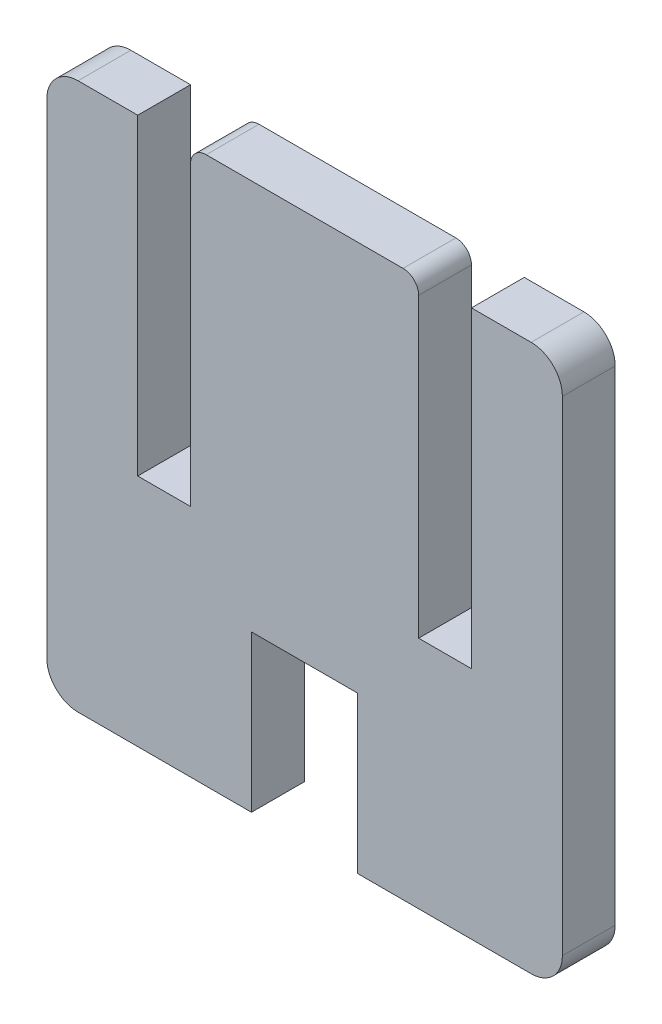
ISO-10303-21;
HEADER;
FILE_DESCRIPTION(('STEP AP214'),'2;1');
FILE_NAME('part.step','',(''),(''),'','','');
FILE_SCHEMA(('AUTOMOTIVE_DESIGN { 1 0 10303 214 1 1 1 1 }'));
ENDSEC;
DATA;
#1=APPLICATION_CONTEXT('core data for automotive mechanical design processes');
#2=APPLICATION_PROTOCOL_DEFINITION('international standard','automotive_design',2000,#1);
#3=PRODUCT_CONTEXT('',#1,'mechanical');
#4=PRODUCT('Part','Part','',(#3));
#5=PRODUCT_RELATED_PRODUCT_CATEGORY('part','',(#4));
#6=PRODUCT_DEFINITION_FORMATION('','',#4);
#7=PRODUCT_DEFINITION_CONTEXT('part definition',#1,'design');
#8=PRODUCT_DEFINITION('design','',#6,#7);
#9=PRODUCT_DEFINITION_SHAPE('','',#8);
#10=(LENGTH_UNIT() NAMED_UNIT(*) SI_UNIT(.MILLI.,.METRE.));
#11=(NAMED_UNIT(*) PLANE_ANGLE_UNIT() SI_UNIT($,.RADIAN.));
#12=(NAMED_UNIT(*) SI_UNIT($,.STERADIAN.) SOLID_ANGLE_UNIT());
#13=UNCERTAINTY_MEASURE_WITH_UNIT(LENGTH_MEASURE(1.E-05),#10,'distance_accuracy_value','');
#14=(GEOMETRIC_REPRESENTATION_CONTEXT(3) GLOBAL_UNCERTAINTY_ASSIGNED_CONTEXT((#13)) GLOBAL_UNIT_ASSIGNED_CONTEXT((#10,
#11,#12)) REPRESENTATION_CONTEXT('',''));
#15=CARTESIAN_POINT('',(0.,0.,0.));
#16=DIRECTION('',(0.,0.,1.));
#17=DIRECTION('',(1.,0.,0.));
#18=AXIS2_PLACEMENT_3D('',#15,#16,#17);
#19=CARTESIAN_POINT('',(-20.955,22.225,4.2926));
#20=DIRECTION('',(0.,-1.,0.));
#21=DIRECTION('',(0.,0.,-1.));
#22=AXIS2_PLACEMENT_3D('',#19,#20,#21);
#23=PLANE('',#22);
#24=DIRECTION('',(-1.,0.,0.));
#25=VECTOR('',#24,1.);
#26=CARTESIAN_POINT('',(-20.955,22.225,4.2926));
#27=LINE('',#26,#25);
#28=CARTESIAN_POINT('',(8.001,22.225,4.2926));
#29=VERTEX_POINT('',#28);
#30=CARTESIAN_POINT('',(-8.001,22.225,4.2926));
#31=VERTEX_POINT('',#30);
#32=EDGE_CURVE('E306',#29,#31,#27,.T.);
#33=ORIENTED_EDGE('',*,*,#32,.F.);
#34=DIRECTION('',(0.,0.,1.));
#35=VECTOR('',#34,1.);
#36=CARTESIAN_POINT('',(8.001,22.225,4.2926));
#37=LINE('',#36,#35);
#38=CARTESIAN_POINT('',(8.001,22.225,0.));
#39=VERTEX_POINT('',#38);
#40=EDGE_CURVE('E402',#29,#39,#37,.F.);
#41=ORIENTED_EDGE('',*,*,#40,.T.);
#42=DIRECTION('',(-1.,0.,0.));
#43=VECTOR('',#42,1.);
#44=CARTESIAN_POINT('',(-20.955,22.225,0.));
#45=LINE('',#44,#43);
#46=CARTESIAN_POINT('',(-8.001,22.225,0.));
#47=VERTEX_POINT('',#46);
#48=EDGE_CURVE('E325',#39,#47,#45,.T.);
#49=ORIENTED_EDGE('',*,*,#48,.T.);
#50=DIRECTION('',(0.,0.,1.));
#51=VECTOR('',#50,1.);
#52=CARTESIAN_POINT('',(-8.001,22.225,4.2926));
#53=LINE('',#52,#51);
#54=EDGE_CURVE('E398',#47,#31,#53,.T.);
#55=ORIENTED_EDGE('',*,*,#54,.T.);
#56=EDGE_LOOP('',(#33,#41,#49,#55));
#57=FACE_BOUND('',#56,.T.);
#58=ADVANCED_FACE('F39',(#57),#23,.F.);
#59=DIRECTION('',(0.,0.,1.));
#60=VECTOR('',#59,1.);
#61=CARTESIAN_POINT('',(13.5636,22.225,0.));
#62=LINE('',#61,#60);
#63=CARTESIAN_POINT('',(13.5636,22.225,0.));
#64=VERTEX_POINT('',#63);
#65=CARTESIAN_POINT('',(13.5636,22.225,4.2926));
#66=VERTEX_POINT('',#65);
#67=EDGE_CURVE('E229',#64,#66,#62,.T.);
#68=ORIENTED_EDGE('',*,*,#67,.T.);
#69=CARTESIAN_POINT('',(18.415,22.225,4.2926));
#70=VERTEX_POINT('',#69);
#71=EDGE_CURVE('E301',#70,#66,#27,.T.);
#72=ORIENTED_EDGE('',*,*,#71,.F.);
#73=DIRECTION('',(0.,0.,-1.));
#74=VECTOR('',#73,1.);
#75=CARTESIAN_POINT('',(18.415,22.225,4.2926));
#76=LINE('',#75,#74);
#77=CARTESIAN_POINT('',(18.415,22.225,0.));
#78=VERTEX_POINT('',#77);
#79=EDGE_CURVE('E384',#70,#78,#76,.T.);
#80=ORIENTED_EDGE('',*,*,#79,.T.);
#81=EDGE_CURVE('E320',#78,#64,#45,.T.);
#82=ORIENTED_EDGE('',*,*,#81,.T.);
#83=EDGE_LOOP('',(#68,#72,#80,#82));
#84=FACE_BOUND('',#83,.T.);
#85=ADVANCED_FACE('F484',(#84),#23,.F.);
#86=CARTESIAN_POINT('',(-20.955,-22.225,4.2926));
#87=DIRECTION('',(0.,1.,0.));
#88=DIRECTION('',(0.,0.,1.));
#89=AXIS2_PLACEMENT_3D('',#86,#87,#88);
#90=PLANE('',#89);
#91=DIRECTION('',(0.,0.,1.));
#92=VECTOR('',#91,1.);
#93=CARTESIAN_POINT('',(-4.318,-22.225,0.));
#94=LINE('',#93,#92);
#95=CARTESIAN_POINT('',(-4.318,-22.225,0.));
#96=VERTEX_POINT('',#95);
#97=CARTESIAN_POINT('',(-4.318,-22.225,4.2926));
#98=VERTEX_POINT('',#97);
#99=EDGE_CURVE('E267',#96,#98,#94,.T.);
#100=ORIENTED_EDGE('',*,*,#99,.T.);
#101=DIRECTION('',(1.,0.,0.));
#102=VECTOR('',#101,1.);
#103=CARTESIAN_POINT('',(-20.955,-22.225,4.2926));
#104=LINE('',#103,#102);
#105=CARTESIAN_POINT('',(-18.415,-22.225,4.2926));
#106=VERTEX_POINT('',#105);
#107=EDGE_CURVE('E311',#106,#98,#104,.T.);
#108=ORIENTED_EDGE('',*,*,#107,.F.);
#109=DIRECTION('',(0.,0.,-1.));
#110=VECTOR('',#109,1.);
#111=CARTESIAN_POINT('',(-18.415,-22.225,4.2926));
#112=LINE('',#111,#110);
#113=CARTESIAN_POINT('',(-18.415,-22.225,0.));
#114=VERTEX_POINT('',#113);
#115=EDGE_CURVE('E336',#106,#114,#112,.T.);
#116=ORIENTED_EDGE('',*,*,#115,.T.);
#117=DIRECTION('',(1.,0.,0.));
#118=VECTOR('',#117,1.);
#119=CARTESIAN_POINT('',(-20.955,-22.225,0.));
#120=LINE('',#119,#118);
#121=EDGE_CURVE('E300',#114,#96,#120,.T.);
#122=ORIENTED_EDGE('',*,*,#121,.T.);
#123=EDGE_LOOP('',(#100,#108,#116,#122));
#124=FACE_BOUND('',#123,.T.);
#125=ADVANCED_FACE('F450',(#124),#90,.F.);
#126=CARTESIAN_POINT('',(0.,0.,4.2926));
#127=DIRECTION('',(0.,0.,-1.));
#128=DIRECTION('',(-1.,0.,0.));
#129=AXIS2_PLACEMENT_3D('',#126,#127,#128);
#130=PLANE('',#129);
#131=DIRECTION('',(0.,-1.,0.));
#132=VECTOR('',#131,1.);
#133=CARTESIAN_POINT('',(9.271,0.,4.2926));
#134=LINE('',#133,#132);
#135=CARTESIAN_POINT('',(9.271,20.955,4.2926));
#136=VERTEX_POINT('',#135);
#137=CARTESIAN_POINT('',(9.271,-3.175,4.2926));
#138=VERTEX_POINT('',#137);
#139=EDGE_CURVE('E246',#136,#138,#134,.T.);
#140=ORIENTED_EDGE('',*,*,#139,.F.);
#141=CARTESIAN_POINT('',(8.001,20.955,4.2926));
#142=DIRECTION('',(0.,0.,-1.));
#143=DIRECTION('',(-1.,0.,0.));
#144=AXIS2_PLACEMENT_3D('',#141,#142,#143);
#145=CIRCLE('',#144,1.27);
#146=EDGE_CURVE('E395',#136,#29,#145,.F.);
#147=ORIENTED_EDGE('',*,*,#146,.T.);
#148=ORIENTED_EDGE('',*,*,#32,.T.);
#149=CARTESIAN_POINT('',(-8.001,20.955,4.2926));
#150=DIRECTION('',(0.,0.,-1.));
#151=DIRECTION('',(-1.,0.,0.));
#152=AXIS2_PLACEMENT_3D('',#149,#150,#151);
#153=CIRCLE('',#152,1.27);
#154=CARTESIAN_POINT('',(-9.271,20.955,4.2926));
#155=VERTEX_POINT('',#154);
#156=EDGE_CURVE('E392',#31,#155,#153,.F.);
#157=ORIENTED_EDGE('',*,*,#156,.T.);
#158=DIRECTION('',(0.,-1.,0.));
#159=VECTOR('',#158,1.);
#160=CARTESIAN_POINT('',(-9.271,0.,4.2926));
#161=LINE('',#160,#159);
#162=CARTESIAN_POINT('',(-9.271,-3.175,4.2926));
#163=VERTEX_POINT('',#162);
#164=EDGE_CURVE('E213',#155,#163,#161,.T.);
#165=ORIENTED_EDGE('',*,*,#164,.T.);
#166=DIRECTION('',(1.,0.,0.));
#167=VECTOR('',#166,1.);
#168=CARTESIAN_POINT('',(0.,-3.175,4.2926));
#169=LINE('',#168,#167);
#170=CARTESIAN_POINT('',(-13.5636,-3.175,4.2926));
#171=VERTEX_POINT('',#170);
#172=EDGE_CURVE('E202',#171,#163,#169,.T.);
#173=ORIENTED_EDGE('',*,*,#172,.F.);
#174=DIRECTION('',(0.,-1.,0.));
#175=VECTOR('',#174,1.);
#176=CARTESIAN_POINT('',(-13.5636,0.,4.2926));
#177=LINE('',#176,#175);
#178=CARTESIAN_POINT('',(-13.5636,22.225,4.2926));
#179=VERTEX_POINT('',#178);
#180=EDGE_CURVE('E209',#179,#171,#177,.T.);
#181=ORIENTED_EDGE('',*,*,#180,.F.);
#182=CARTESIAN_POINT('',(-18.415,22.225,4.2926));
#183=VERTEX_POINT('',#182);
#184=EDGE_CURVE('E299',#179,#183,#27,.T.);
#185=ORIENTED_EDGE('',*,*,#184,.T.);
#186=CARTESIAN_POINT('',(-18.415,19.685,4.2926));
#187=DIRECTION('',(0.,0.,-1.));
#188=DIRECTION('',(-1.,0.,0.));
#189=AXIS2_PLACEMENT_3D('',#186,#187,#188);
#190=CIRCLE('',#189,2.54);
#191=CARTESIAN_POINT('',(-20.955,19.685,4.2926));
#192=VERTEX_POINT('',#191);
#193=EDGE_CURVE('E361',#183,#192,#190,.F.);
#194=ORIENTED_EDGE('',*,*,#193,.T.);
#195=DIRECTION('',(0.,-1.,0.));
#196=VECTOR('',#195,1.);
#197=CARTESIAN_POINT('',(-20.955,-22.225,4.2926));
#198=LINE('',#197,#196);
#199=CARTESIAN_POINT('',(-20.955,-19.685,4.2926));
#200=VERTEX_POINT('',#199);
#201=EDGE_CURVE('E305',#192,#200,#198,.T.);
#202=ORIENTED_EDGE('',*,*,#201,.T.);
#203=CARTESIAN_POINT('',(-18.415,-19.685,4.2926));
#204=DIRECTION('',(0.,0.,-1.));
#205=DIRECTION('',(-1.,0.,0.));
#206=AXIS2_PLACEMENT_3D('',#203,#204,#205);
#207=CIRCLE('',#206,2.54);
#208=EDGE_CURVE('E370',#200,#106,#207,.F.);
#209=ORIENTED_EDGE('',*,*,#208,.T.);
#210=ORIENTED_EDGE('',*,*,#107,.T.);
#211=DIRECTION('',(0.,1.,0.));
#212=VECTOR('',#211,1.);
#213=CARTESIAN_POINT('',(-4.318,-22.225,4.2926));
#214=LINE('',#213,#212);
#215=CARTESIAN_POINT('',(-4.318,-9.525,4.2926));
#216=VERTEX_POINT('',#215);
#217=EDGE_CURVE('E275',#98,#216,#214,.T.);
#218=ORIENTED_EDGE('',*,*,#217,.T.);
#219=DIRECTION('',(1.,0.,0.));
#220=VECTOR('',#219,1.);
#221=CARTESIAN_POINT('',(-4.318,-9.525,4.2926));
#222=LINE('',#221,#220);
#223=CARTESIAN_POINT('',(4.318,-9.525,4.2926));
#224=VERTEX_POINT('',#223);
#225=EDGE_CURVE('E241',#216,#224,#222,.T.);
#226=ORIENTED_EDGE('',*,*,#225,.T.);
#227=DIRECTION('',(0.,1.,0.));
#228=VECTOR('',#227,1.);
#229=CARTESIAN_POINT('',(4.318,-22.225,4.2926));
#230=LINE('',#229,#228);
#231=CARTESIAN_POINT('',(4.318,-22.225,4.2926));
#232=VERTEX_POINT('',#231);
#233=EDGE_CURVE('E279',#232,#224,#230,.T.);
#234=ORIENTED_EDGE('',*,*,#233,.F.);
#235=CARTESIAN_POINT('',(18.415,-22.225,4.2926));
#236=VERTEX_POINT('',#235);
#237=EDGE_CURVE('E310',#232,#236,#104,.T.);
#238=ORIENTED_EDGE('',*,*,#237,.T.);
#239=CARTESIAN_POINT('',(18.415,-19.685,4.2926));
#240=DIRECTION('',(0.,0.,-1.));
#241=DIRECTION('',(-1.,0.,0.));
#242=AXIS2_PLACEMENT_3D('',#239,#240,#241);
#243=CIRCLE('',#242,2.54);
#244=CARTESIAN_POINT('',(20.955,-19.685,4.2926));
#245=VERTEX_POINT('',#244);
#246=EDGE_CURVE('E367',#236,#245,#243,.F.);
#247=ORIENTED_EDGE('',*,*,#246,.T.);
#248=DIRECTION('',(0.,1.,0.));
#249=VECTOR('',#248,1.);
#250=CARTESIAN_POINT('',(20.955,-22.225,4.2926));
#251=LINE('',#250,#249);
#252=CARTESIAN_POINT('',(20.955,19.685,4.2926));
#253=VERTEX_POINT('',#252);
#254=EDGE_CURVE('E295',#245,#253,#251,.T.);
#255=ORIENTED_EDGE('',*,*,#254,.T.);
#256=CARTESIAN_POINT('',(18.415,19.685,4.2926));
#257=DIRECTION('',(0.,0.,-1.));
#258=DIRECTION('',(-1.,0.,0.));
#259=AXIS2_PLACEMENT_3D('',#256,#257,#258);
#260=CIRCLE('',#259,2.54);
#261=EDGE_CURVE('E364',#253,#70,#260,.F.);
#262=ORIENTED_EDGE('',*,*,#261,.T.);
#263=ORIENTED_EDGE('',*,*,#71,.T.);
#264=DIRECTION('',(0.,-1.,0.));
#265=VECTOR('',#264,1.);
#266=CARTESIAN_POINT('',(13.5636,0.,4.2926));
#267=LINE('',#266,#265);
#268=CARTESIAN_POINT('',(13.5636,-3.175,4.2926));
#269=VERTEX_POINT('',#268);
#270=EDGE_CURVE('E220',#66,#269,#267,.T.);
#271=ORIENTED_EDGE('',*,*,#270,.T.);
#272=DIRECTION('',(1.,0.,0.));
#273=VECTOR('',#272,1.);
#274=CARTESIAN_POINT('',(0.,-3.175,4.2926));
#275=LINE('',#274,#273);
#276=EDGE_CURVE('E242',#138,#269,#275,.T.);
#277=ORIENTED_EDGE('',*,*,#276,.F.);
#278=EDGE_LOOP('',(#140,#147,#148,#157,#165,#173,#181,#185,#194,#202,#209,#210,#218,#226,#234,
#238,#247,#255,#262,#263,#271,#277));
#279=FACE_BOUND('',#278,.T.);
#280=ADVANCED_FACE('F421',(#279),#130,.F.);
#281=CARTESIAN_POINT('',(0.,0.,0.));
#282=DIRECTION('',(0.,0.,-1.));
#283=DIRECTION('',(-1.,0.,0.));
#284=AXIS2_PLACEMENT_3D('',#281,#282,#283);
#285=PLANE('',#284);
#286=ORIENTED_EDGE('',*,*,#48,.F.);
#287=CARTESIAN_POINT('',(8.001,20.955,0.));
#288=DIRECTION('',(0.,0.,-1.));
#289=DIRECTION('',(-1.,0.,0.));
#290=AXIS2_PLACEMENT_3D('',#287,#288,#289);
#291=CIRCLE('',#290,1.27);
#292=CARTESIAN_POINT('',(9.271,20.955,0.));
#293=VERTEX_POINT('',#292);
#294=EDGE_CURVE('E48',#39,#293,#291,.T.);
#295=ORIENTED_EDGE('',*,*,#294,.T.);
#296=DIRECTION('',(0.,-1.,0.));
#297=VECTOR('',#296,1.);
#298=CARTESIAN_POINT('',(9.271,0.,0.));
#299=LINE('',#298,#297);
#300=CARTESIAN_POINT('',(9.271,-3.175,0.));
#301=VERTEX_POINT('',#300);
#302=EDGE_CURVE('E256',#293,#301,#299,.T.);
#303=ORIENTED_EDGE('',*,*,#302,.T.);
#304=DIRECTION('',(1.,0.,0.));
#305=VECTOR('',#304,1.);
#306=CARTESIAN_POINT('',(0.,-3.175,0.));
#307=LINE('',#306,#305);
#308=CARTESIAN_POINT('',(13.5636,-3.175,0.));
#309=VERTEX_POINT('',#308);
#310=EDGE_CURVE('E233',#301,#309,#307,.T.);
#311=ORIENTED_EDGE('',*,*,#310,.T.);
#312=DIRECTION('',(0.,-1.,0.));
#313=VECTOR('',#312,1.);
#314=CARTESIAN_POINT('',(13.5636,0.,0.));
#315=LINE('',#314,#313);
#316=EDGE_CURVE('E247',#64,#309,#315,.T.);
#317=ORIENTED_EDGE('',*,*,#316,.F.);
#318=ORIENTED_EDGE('',*,*,#81,.F.);
#319=CARTESIAN_POINT('',(18.415,19.685,0.));
#320=DIRECTION('',(0.,0.,-1.));
#321=DIRECTION('',(-1.,0.,0.));
#322=AXIS2_PLACEMENT_3D('',#319,#320,#321);
#323=CIRCLE('',#322,2.54);
#324=CARTESIAN_POINT('',(20.955,19.685,0.));
#325=VERTEX_POINT('',#324);
#326=EDGE_CURVE('E344',#78,#325,#323,.T.);
#327=ORIENTED_EDGE('',*,*,#326,.T.);
#328=DIRECTION('',(0.,1.,0.));
#329=VECTOR('',#328,1.);
#330=CARTESIAN_POINT('',(20.955,-22.225,0.));
#331=LINE('',#330,#329);
#332=CARTESIAN_POINT('',(20.955,-19.685,0.));
#333=VERTEX_POINT('',#332);
#334=EDGE_CURVE('E226',#333,#325,#331,.T.);
#335=ORIENTED_EDGE('',*,*,#334,.F.);
#336=CARTESIAN_POINT('',(18.415,-19.685,0.));
#337=DIRECTION('',(0.,0.,-1.));
#338=DIRECTION('',(-1.,0.,0.));
#339=AXIS2_PLACEMENT_3D('',#336,#337,#338);
#340=CIRCLE('',#339,2.54);
#341=CARTESIAN_POINT('',(18.415,-22.225,0.));
#342=VERTEX_POINT('',#341);
#343=EDGE_CURVE('E347',#333,#342,#340,.T.);
#344=ORIENTED_EDGE('',*,*,#343,.T.);
#345=CARTESIAN_POINT('',(4.318,-22.225,0.));
#346=VERTEX_POINT('',#345);
#347=EDGE_CURVE('E329',#346,#342,#120,.T.);
#348=ORIENTED_EDGE('',*,*,#347,.F.);
#349=DIRECTION('',(0.,1.,0.));
#350=VECTOR('',#349,1.);
#351=CARTESIAN_POINT('',(4.318,-22.225,0.));
#352=LINE('',#351,#350);
#353=CARTESIAN_POINT('',(4.318,-9.525,0.));
#354=VERTEX_POINT('',#353);
#355=EDGE_CURVE('E289',#346,#354,#352,.T.);
#356=ORIENTED_EDGE('',*,*,#355,.T.);
#357=DIRECTION('',(1.,0.,0.));
#358=VECTOR('',#357,1.);
#359=CARTESIAN_POINT('',(-4.318,-9.525,0.));
#360=LINE('',#359,#358);
#361=CARTESIAN_POINT('',(-4.318,-9.525,0.));
#362=VERTEX_POINT('',#361);
#363=EDGE_CURVE('E280',#362,#354,#360,.T.);
#364=ORIENTED_EDGE('',*,*,#363,.F.);
#365=DIRECTION('',(0.,1.,0.));
#366=VECTOR('',#365,1.);
#367=CARTESIAN_POINT('',(-4.318,-22.225,0.));
#368=LINE('',#367,#366);
#369=EDGE_CURVE('E274',#96,#362,#368,.T.);
#370=ORIENTED_EDGE('',*,*,#369,.F.);
#371=ORIENTED_EDGE('',*,*,#121,.F.);
#372=CARTESIAN_POINT('',(-18.415,-19.685,0.));
#373=DIRECTION('',(0.,0.,-1.));
#374=DIRECTION('',(-1.,0.,0.));
#375=AXIS2_PLACEMENT_3D('',#372,#373,#374);
#376=CIRCLE('',#375,2.54);
#377=CARTESIAN_POINT('',(-20.955,-19.685,0.));
#378=VERTEX_POINT('',#377);
#379=EDGE_CURVE('E351',#114,#378,#376,.T.);
#380=ORIENTED_EDGE('',*,*,#379,.T.);
#381=DIRECTION('',(0.,-1.,0.));
#382=VECTOR('',#381,1.);
#383=CARTESIAN_POINT('',(-20.955,-22.225,0.));
#384=LINE('',#383,#382);
#385=CARTESIAN_POINT('',(-20.955,19.685,0.));
#386=VERTEX_POINT('',#385);
#387=EDGE_CURVE('E324',#386,#378,#384,.T.);
#388=ORIENTED_EDGE('',*,*,#387,.F.);
#389=CARTESIAN_POINT('',(-18.415,19.685,0.));
#390=DIRECTION('',(0.,0.,-1.));
#391=DIRECTION('',(-1.,0.,0.));
#392=AXIS2_PLACEMENT_3D('',#389,#390,#391);
#393=CIRCLE('',#392,2.54);
#394=CARTESIAN_POINT('',(-18.415,22.225,0.));
#395=VERTEX_POINT('',#394);
#396=EDGE_CURVE('E340',#386,#395,#393,.T.);
#397=ORIENTED_EDGE('',*,*,#396,.T.);
#398=CARTESIAN_POINT('',(-13.5636,22.225,0.));
#399=VERTEX_POINT('',#398);
#400=EDGE_CURVE('E319',#399,#395,#45,.T.);
#401=ORIENTED_EDGE('',*,*,#400,.F.);
#402=DIRECTION('',(0.,-1.,0.));
#403=VECTOR('',#402,1.);
#404=CARTESIAN_POINT('',(-13.5636,0.,0.));
#405=LINE('',#404,#403);
#406=CARTESIAN_POINT('',(-13.5636,-3.175,0.));
#407=VERTEX_POINT('',#406);
#408=EDGE_CURVE('E194',#399,#407,#405,.T.);
#409=ORIENTED_EDGE('',*,*,#408,.T.);
#410=DIRECTION('',(1.,0.,0.));
#411=VECTOR('',#410,1.);
#412=CARTESIAN_POINT('',(0.,-3.175,0.));
#413=LINE('',#412,#411);
#414=CARTESIAN_POINT('',(-9.271,-3.175,0.));
#415=VERTEX_POINT('',#414);
#416=EDGE_CURVE('E195',#407,#415,#413,.T.);
#417=ORIENTED_EDGE('',*,*,#416,.T.);
#418=DIRECTION('',(0.,-1.,0.));
#419=VECTOR('',#418,1.);
#420=CARTESIAN_POINT('',(-9.271,0.,0.));
#421=LINE('',#420,#419);
#422=CARTESIAN_POINT('',(-9.271,20.955,0.));
#423=VERTEX_POINT('',#422);
#424=EDGE_CURVE('E187',#423,#415,#421,.T.);
#425=ORIENTED_EDGE('',*,*,#424,.F.);
#426=CARTESIAN_POINT('',(-8.001,20.955,0.));
#427=DIRECTION('',(0.,0.,-1.));
#428=DIRECTION('',(-1.,0.,0.));
#429=AXIS2_PLACEMENT_3D('',#426,#427,#428);
#430=CIRCLE('',#429,1.27);
#431=EDGE_CURVE('E60',#423,#47,#430,.T.);
#432=ORIENTED_EDGE('',*,*,#431,.T.);
#433=EDGE_LOOP('',(#286,#295,#303,#311,#317,#318,#327,#335,#344,#348,#356,#364,#370,#371,#380,
#388,#397,#401,#409,#417,#425,#432));
#434=FACE_BOUND('',#433,.T.);
#435=ADVANCED_FACE('F206',(#434),#285,.T.);
#436=CARTESIAN_POINT('',(20.955,-22.225,4.2926));
#437=DIRECTION('',(-1.,0.,0.));
#438=DIRECTION('',(0.,0.,1.));
#439=AXIS2_PLACEMENT_3D('',#436,#437,#438);
#440=PLANE('',#439);
#441=ORIENTED_EDGE('',*,*,#254,.F.);
#442=DIRECTION('',(0.,0.,-1.));
#443=VECTOR('',#442,1.);
#444=CARTESIAN_POINT('',(20.955,-19.685,4.2926));
#445=LINE('',#444,#443);
#446=EDGE_CURVE('E376',#245,#333,#445,.T.);
#447=ORIENTED_EDGE('',*,*,#446,.T.);
#448=ORIENTED_EDGE('',*,*,#334,.T.);
#449=DIRECTION('',(0.,0.,-1.));
#450=VECTOR('',#449,1.);
#451=CARTESIAN_POINT('',(20.955,19.685,4.2926));
#452=LINE('',#451,#450);
#453=EDGE_CURVE('E373',#325,#253,#452,.F.);
#454=ORIENTED_EDGE('',*,*,#453,.T.);
#455=EDGE_LOOP('',(#441,#447,#448,#454));
#456=FACE_BOUND('',#455,.T.);
#457=ADVANCED_FACE('F476',(#456),#440,.F.);
#458=ORIENTED_EDGE('',*,*,#184,.F.);
#459=DIRECTION('',(0.,0.,1.));
#460=VECTOR('',#459,1.);
#461=CARTESIAN_POINT('',(-13.5636,22.225,0.));
#462=LINE('',#461,#460);
#463=EDGE_CURVE('E204',#399,#179,#462,.T.);
#464=ORIENTED_EDGE('',*,*,#463,.F.);
#465=ORIENTED_EDGE('',*,*,#400,.T.);
#466=DIRECTION('',(0.,0.,-1.));
#467=VECTOR('',#466,1.);
#468=CARTESIAN_POINT('',(-18.415,22.225,4.2926));
#469=LINE('',#468,#467);
#470=EDGE_CURVE('E380',#395,#183,#469,.F.);
#471=ORIENTED_EDGE('',*,*,#470,.T.);
#472=EDGE_LOOP('',(#458,#464,#465,#471));
#473=FACE_BOUND('',#472,.T.);
#474=ADVANCED_FACE('F434',(#473),#23,.F.);
#475=CARTESIAN_POINT('',(-20.955,-22.225,4.2926));
#476=DIRECTION('',(1.,0.,0.));
#477=DIRECTION('',(0.,0.,-1.));
#478=AXIS2_PLACEMENT_3D('',#475,#476,#477);
#479=PLANE('',#478);
#480=ORIENTED_EDGE('',*,*,#387,.T.);
#481=DIRECTION('',(0.,0.,-1.));
#482=VECTOR('',#481,1.);
#483=CARTESIAN_POINT('',(-20.955,-19.685,4.2926));
#484=LINE('',#483,#482);
#485=EDGE_CURVE('E358',#378,#200,#484,.F.);
#486=ORIENTED_EDGE('',*,*,#485,.T.);
#487=ORIENTED_EDGE('',*,*,#201,.F.);
#488=DIRECTION('',(0.,0.,-1.));
#489=VECTOR('',#488,1.);
#490=CARTESIAN_POINT('',(-20.955,19.685,4.2926));
#491=LINE('',#490,#489);
#492=EDGE_CURVE('E354',#192,#386,#491,.T.);
#493=ORIENTED_EDGE('',*,*,#492,.T.);
#494=EDGE_LOOP('',(#480,#486,#487,#493));
#495=FACE_BOUND('',#494,.T.);
#496=ADVANCED_FACE('F440',(#495),#479,.F.);
#497=ORIENTED_EDGE('',*,*,#237,.F.);
#498=DIRECTION('',(0.,0.,1.));
#499=VECTOR('',#498,1.);
#500=CARTESIAN_POINT('',(4.318,-22.225,0.));
#501=LINE('',#500,#499);
#502=EDGE_CURVE('E264',#346,#232,#501,.T.);
#503=ORIENTED_EDGE('',*,*,#502,.F.);
#504=ORIENTED_EDGE('',*,*,#347,.T.);
#505=DIRECTION('',(0.,0.,-1.));
#506=VECTOR('',#505,1.);
#507=CARTESIAN_POINT('',(18.415,-22.225,4.2926));
#508=LINE('',#507,#506);
#509=EDGE_CURVE('E315',#342,#236,#508,.F.);
#510=ORIENTED_EDGE('',*,*,#509,.T.);
#511=EDGE_LOOP('',(#497,#503,#504,#510));
#512=FACE_BOUND('',#511,.T.);
#513=ADVANCED_FACE('F465',(#512),#90,.F.);
#514=CARTESIAN_POINT('',(-18.415,-19.685,4.2926));
#515=DIRECTION('',(0.,0.,-1.));
#516=DIRECTION('',(-1.,0.,0.));
#517=AXIS2_PLACEMENT_3D('',#514,#515,#516);
#518=CYLINDRICAL_SURFACE('',#517,2.54);
#519=ORIENTED_EDGE('',*,*,#208,.F.);
#520=ORIENTED_EDGE('',*,*,#485,.F.);
#521=ORIENTED_EDGE('',*,*,#379,.F.);
#522=ORIENTED_EDGE('',*,*,#115,.F.);
#523=EDGE_LOOP('',(#519,#520,#521,#522));
#524=FACE_BOUND('',#523,.T.);
#525=ADVANCED_FACE('F447',(#524),#518,.T.);
#526=CARTESIAN_POINT('',(18.415,-19.685,4.2926));
#527=DIRECTION('',(0.,0.,-1.));
#528=DIRECTION('',(-1.,0.,0.));
#529=AXIS2_PLACEMENT_3D('',#526,#527,#528);
#530=CYLINDRICAL_SURFACE('',#529,2.54);
#531=ORIENTED_EDGE('',*,*,#246,.F.);
#532=ORIENTED_EDGE('',*,*,#509,.F.);
#533=ORIENTED_EDGE('',*,*,#343,.F.);
#534=ORIENTED_EDGE('',*,*,#446,.F.);
#535=EDGE_LOOP('',(#531,#532,#533,#534));
#536=FACE_BOUND('',#535,.T.);
#537=ADVANCED_FACE('F472',(#536),#530,.T.);
#538=CARTESIAN_POINT('',(18.415,19.685,4.2926));
#539=DIRECTION('',(0.,0.,-1.));
#540=DIRECTION('',(-1.,0.,0.));
#541=AXIS2_PLACEMENT_3D('',#538,#539,#540);
#542=CYLINDRICAL_SURFACE('',#541,2.54);
#543=ORIENTED_EDGE('',*,*,#261,.F.);
#544=ORIENTED_EDGE('',*,*,#453,.F.);
#545=ORIENTED_EDGE('',*,*,#326,.F.);
#546=ORIENTED_EDGE('',*,*,#79,.F.);
#547=EDGE_LOOP('',(#543,#544,#545,#546));
#548=FACE_BOUND('',#547,.T.);
#549=ADVANCED_FACE('F480',(#548),#542,.T.);
#550=CARTESIAN_POINT('',(-18.415,19.685,4.2926));
#551=DIRECTION('',(0.,0.,-1.));
#552=DIRECTION('',(-1.,0.,0.));
#553=AXIS2_PLACEMENT_3D('',#550,#551,#552);
#554=CYLINDRICAL_SURFACE('',#553,2.54);
#555=ORIENTED_EDGE('',*,*,#193,.F.);
#556=ORIENTED_EDGE('',*,*,#470,.F.);
#557=ORIENTED_EDGE('',*,*,#396,.F.);
#558=ORIENTED_EDGE('',*,*,#492,.F.);
#559=EDGE_LOOP('',(#555,#556,#557,#558));
#560=FACE_BOUND('',#559,.T.);
#561=ADVANCED_FACE('F437',(#560),#554,.T.);
#562=CARTESIAN_POINT('',(-4.318,-9.525,0.));
#563=DIRECTION('',(0.,-1.,0.));
#564=DIRECTION('',(0.,0.,-1.));
#565=AXIS2_PLACEMENT_3D('',#562,#563,#564);
#566=PLANE('',#565);
#567=ORIENTED_EDGE('',*,*,#225,.F.);
#568=DIRECTION('',(0.,0.,1.));
#569=VECTOR('',#568,1.);
#570=CARTESIAN_POINT('',(-4.318,-9.525,0.));
#571=LINE('',#570,#569);
#572=EDGE_CURVE('E271',#362,#216,#571,.T.);
#573=ORIENTED_EDGE('',*,*,#572,.F.);
#574=ORIENTED_EDGE('',*,*,#363,.T.);
#575=DIRECTION('',(0.,0.,1.));
#576=VECTOR('',#575,1.);
#577=CARTESIAN_POINT('',(4.318,-9.525,0.));
#578=LINE('',#577,#576);
#579=EDGE_CURVE('E261',#354,#224,#578,.T.);
#580=ORIENTED_EDGE('',*,*,#579,.T.);
#581=EDGE_LOOP('',(#567,#573,#574,#580));
#582=FACE_BOUND('',#581,.T.);
#583=ADVANCED_FACE('F458',(#582),#566,.T.);
#584=CARTESIAN_POINT('',(4.318,-22.225,0.));
#585=DIRECTION('',(1.,0.,0.));
#586=DIRECTION('',(0.,0.,-1.));
#587=AXIS2_PLACEMENT_3D('',#584,#585,#586);
#588=PLANE('',#587);
#589=ORIENTED_EDGE('',*,*,#233,.T.);
#590=ORIENTED_EDGE('',*,*,#579,.F.);
#591=ORIENTED_EDGE('',*,*,#355,.F.);
#592=ORIENTED_EDGE('',*,*,#502,.T.);
#593=EDGE_LOOP('',(#589,#590,#591,#592));
#594=FACE_BOUND('',#593,.T.);
#595=ADVANCED_FACE('F461',(#594),#588,.F.);
#596=CARTESIAN_POINT('',(-4.318,-22.225,0.));
#597=DIRECTION('',(1.,0.,0.));
#598=DIRECTION('',(0.,0.,-1.));
#599=AXIS2_PLACEMENT_3D('',#596,#597,#598);
#600=PLANE('',#599);
#601=ORIENTED_EDGE('',*,*,#217,.F.);
#602=ORIENTED_EDGE('',*,*,#99,.F.);
#603=ORIENTED_EDGE('',*,*,#369,.T.);
#604=ORIENTED_EDGE('',*,*,#572,.T.);
#605=EDGE_LOOP('',(#601,#602,#603,#604));
#606=FACE_BOUND('',#605,.T.);
#607=ADVANCED_FACE('F454',(#606),#600,.T.);
#608=CARTESIAN_POINT('',(13.5636,0.,0.));
#609=DIRECTION('',(-1.,0.,0.));
#610=DIRECTION('',(0.,0.,1.));
#611=AXIS2_PLACEMENT_3D('',#608,#609,#610);
#612=PLANE('',#611);
#613=ORIENTED_EDGE('',*,*,#270,.F.);
#614=ORIENTED_EDGE('',*,*,#67,.F.);
#615=ORIENTED_EDGE('',*,*,#316,.T.);
#616=DIRECTION('',(0.,0.,1.));
#617=VECTOR('',#616,1.);
#618=CARTESIAN_POINT('',(13.5636,-3.175,0.));
#619=LINE('',#618,#617);
#620=EDGE_CURVE('E238',#309,#269,#619,.T.);
#621=ORIENTED_EDGE('',*,*,#620,.T.);
#622=EDGE_LOOP('',(#613,#614,#615,#621));
#623=FACE_BOUND('',#622,.T.);
#624=ADVANCED_FACE('F488',(#623),#612,.T.);
#625=CARTESIAN_POINT('',(0.,-3.175,0.));
#626=DIRECTION('',(0.,-1.,0.));
#627=DIRECTION('',(0.,0.,-1.));
#628=AXIS2_PLACEMENT_3D('',#625,#626,#627);
#629=PLANE('',#628);
#630=ORIENTED_EDGE('',*,*,#276,.T.);
#631=ORIENTED_EDGE('',*,*,#620,.F.);
#632=ORIENTED_EDGE('',*,*,#310,.F.);
#633=DIRECTION('',(0.,0.,1.));
#634=VECTOR('',#633,1.);
#635=CARTESIAN_POINT('',(9.271,-3.175,0.));
#636=LINE('',#635,#634);
#637=EDGE_CURVE('E234',#301,#138,#636,.T.);
#638=ORIENTED_EDGE('',*,*,#637,.T.);
#639=EDGE_LOOP('',(#630,#631,#632,#638));
#640=FACE_BOUND('',#639,.T.);
#641=ADVANCED_FACE('F491',(#640),#629,.F.);
#642=CARTESIAN_POINT('',(9.271,0.,0.));
#643=DIRECTION('',(-1.,0.,0.));
#644=DIRECTION('',(0.,0.,1.));
#645=AXIS2_PLACEMENT_3D('',#642,#643,#644);
#646=PLANE('',#645);
#647=ORIENTED_EDGE('',*,*,#302,.F.);
#648=DIRECTION('',(0.,0.,1.));
#649=VECTOR('',#648,1.);
#650=CARTESIAN_POINT('',(9.271,20.955,0.));
#651=LINE('',#650,#649);
#652=EDGE_CURVE('E388',#293,#136,#651,.T.);
#653=ORIENTED_EDGE('',*,*,#652,.T.);
#654=ORIENTED_EDGE('',*,*,#139,.T.);
#655=ORIENTED_EDGE('',*,*,#637,.F.);
#656=EDGE_LOOP('',(#647,#653,#654,#655));
#657=FACE_BOUND('',#656,.T.);
#658=ADVANCED_FACE('F415',(#657),#646,.F.);
#659=CARTESIAN_POINT('',(0.,-3.175,0.));
#660=DIRECTION('',(0.,-1.,0.));
#661=DIRECTION('',(0.,0.,-1.));
#662=AXIS2_PLACEMENT_3D('',#659,#660,#661);
#663=PLANE('',#662);
#664=ORIENTED_EDGE('',*,*,#172,.T.);
#665=DIRECTION('',(0.,0.,1.));
#666=VECTOR('',#665,1.);
#667=CARTESIAN_POINT('',(-9.271,-3.175,0.));
#668=LINE('',#667,#666);
#669=EDGE_CURVE('E190',#415,#163,#668,.T.);
#670=ORIENTED_EDGE('',*,*,#669,.F.);
#671=ORIENTED_EDGE('',*,*,#416,.F.);
#672=DIRECTION('',(0.,0.,1.));
#673=VECTOR('',#672,1.);
#674=CARTESIAN_POINT('',(-13.5636,-3.175,0.));
#675=LINE('',#674,#673);
#676=EDGE_CURVE('E223',#407,#171,#675,.T.);
#677=ORIENTED_EDGE('',*,*,#676,.T.);
#678=EDGE_LOOP('',(#664,#670,#671,#677));
#679=FACE_BOUND('',#678,.T.);
#680=ADVANCED_FACE('F199',(#679),#663,.F.);
#681=CARTESIAN_POINT('',(-13.5636,0.,0.));
#682=DIRECTION('',(-1.,0.,0.));
#683=DIRECTION('',(0.,0.,1.));
#684=AXIS2_PLACEMENT_3D('',#681,#682,#683);
#685=PLANE('',#684);
#686=ORIENTED_EDGE('',*,*,#180,.T.);
#687=ORIENTED_EDGE('',*,*,#676,.F.);
#688=ORIENTED_EDGE('',*,*,#408,.F.);
#689=ORIENTED_EDGE('',*,*,#463,.T.);
#690=EDGE_LOOP('',(#686,#687,#688,#689));
#691=FACE_BOUND('',#690,.T.);
#692=ADVANCED_FACE('F531',(#691),#685,.F.);
#693=CARTESIAN_POINT('',(-9.271,0.,0.));
#694=DIRECTION('',(-1.,0.,0.));
#695=DIRECTION('',(0.,0.,1.));
#696=AXIS2_PLACEMENT_3D('',#693,#694,#695);
#697=PLANE('',#696);
#698=ORIENTED_EDGE('',*,*,#164,.F.);
#699=DIRECTION('',(0.,0.,1.));
#700=VECTOR('',#699,1.);
#701=CARTESIAN_POINT('',(-9.271,20.955,0.));
#702=LINE('',#701,#700);
#703=EDGE_CURVE('E11',#155,#423,#702,.F.);
#704=ORIENTED_EDGE('',*,*,#703,.T.);
#705=ORIENTED_EDGE('',*,*,#424,.T.);
#706=ORIENTED_EDGE('',*,*,#669,.T.);
#707=EDGE_LOOP('',(#698,#704,#705,#706));
#708=FACE_BOUND('',#707,.T.);
#709=ADVANCED_FACE('F189',(#708),#697,.T.);
#710=CARTESIAN_POINT('',(8.001,20.955,0.));
#711=DIRECTION('',(0.,0.,1.));
#712=DIRECTION('',(1.,0.,0.));
#713=AXIS2_PLACEMENT_3D('',#710,#711,#712);
#714=CYLINDRICAL_SURFACE('',#713,1.27);
#715=ORIENTED_EDGE('',*,*,#294,.F.);
#716=ORIENTED_EDGE('',*,*,#40,.F.);
#717=ORIENTED_EDGE('',*,*,#146,.F.);
#718=ORIENTED_EDGE('',*,*,#652,.F.);
#719=EDGE_LOOP('',(#715,#716,#717,#718));
#720=FACE_BOUND('',#719,.T.);
#721=ADVANCED_FACE('F417',(#720),#714,.T.);
#722=CARTESIAN_POINT('',(-8.001,20.955,4.2926));
#723=DIRECTION('',(0.,0.,-1.));
#724=DIRECTION('',(-1.,0.,0.));
#725=AXIS2_PLACEMENT_3D('',#722,#723,#724);
#726=CYLINDRICAL_SURFACE('',#725,1.27);
#727=ORIENTED_EDGE('',*,*,#431,.F.);
#728=ORIENTED_EDGE('',*,*,#703,.F.);
#729=ORIENTED_EDGE('',*,*,#156,.F.);
#730=ORIENTED_EDGE('',*,*,#54,.F.);
#731=EDGE_LOOP('',(#727,#728,#729,#730));
#732=FACE_BOUND('',#731,.T.);
#733=ADVANCED_FACE('F41',(#732),#726,.T.);
#734=CLOSED_SHELL('',(#58,#85,#125,#280,#435,#457,#474,#496,#513,#525,#537,#549,#561,#583,#595,
#607,#624,#641,#658,#680,#692,#709,#721,#733));
#735=MANIFOLD_SOLID_BREP('B2',#734);
#736=ADVANCED_BREP_SHAPE_REPRESENTATION('',(#18,#735),#14);
#737=SHAPE_DEFINITION_REPRESENTATION(#9,#736);
ENDSEC;
END-ISO-10303-21;
